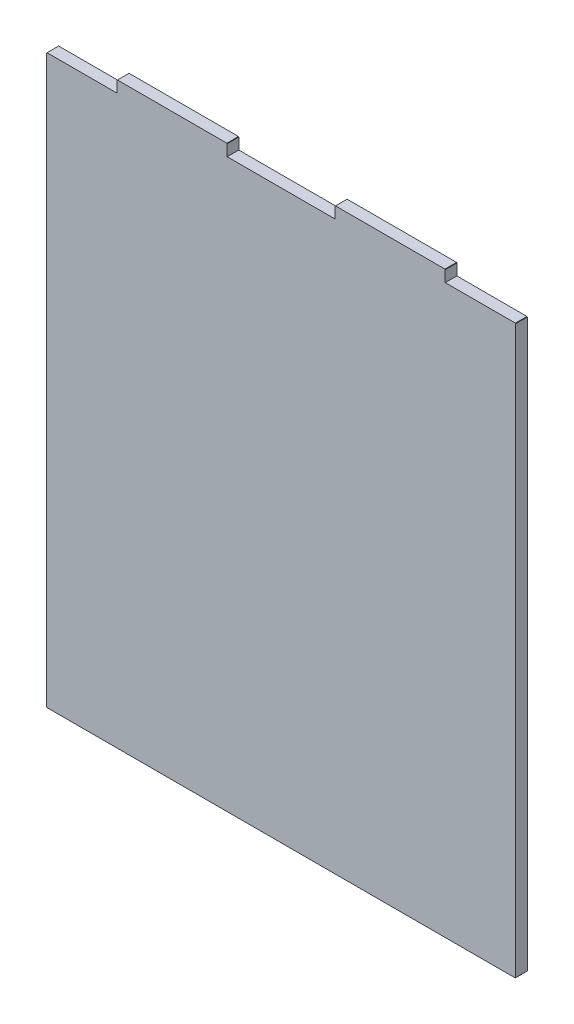
ISO-10303-21;
HEADER;
FILE_DESCRIPTION(('STEP AP214'),'2;1');
FILE_NAME('part.step','',(''),(''),'','','');
FILE_SCHEMA(('AUTOMOTIVE_DESIGN { 1 0 10303 214 1 1 1 1 }'));
ENDSEC;
DATA;
#1=APPLICATION_CONTEXT('core data for automotive mechanical design processes');
#2=APPLICATION_PROTOCOL_DEFINITION('international standard','automotive_design',2000,#1);
#3=PRODUCT_CONTEXT('',#1,'mechanical');
#4=PRODUCT('Part','Part','',(#3));
#5=PRODUCT_RELATED_PRODUCT_CATEGORY('part','',(#4));
#6=PRODUCT_DEFINITION_FORMATION('','',#4);
#7=PRODUCT_DEFINITION_CONTEXT('part definition',#1,'design');
#8=PRODUCT_DEFINITION('design','',#6,#7);
#9=PRODUCT_DEFINITION_SHAPE('','',#8);
#10=(LENGTH_UNIT() NAMED_UNIT(*) SI_UNIT(.MILLI.,.METRE.));
#11=(NAMED_UNIT(*) PLANE_ANGLE_UNIT() SI_UNIT($,.RADIAN.));
#12=(NAMED_UNIT(*) SI_UNIT($,.STERADIAN.) SOLID_ANGLE_UNIT());
#13=UNCERTAINTY_MEASURE_WITH_UNIT(LENGTH_MEASURE(1.E-05),#10,'distance_accuracy_value','');
#14=(GEOMETRIC_REPRESENTATION_CONTEXT(3) GLOBAL_UNCERTAINTY_ASSIGNED_CONTEXT((#13)) GLOBAL_UNIT_ASSIGNED_CONTEXT((#10,
#11,#12)) REPRESENTATION_CONTEXT('',''));
#15=CARTESIAN_POINT('',(0.,0.,0.));
#16=DIRECTION('',(0.,0.,1.));
#17=DIRECTION('',(1.,0.,0.));
#18=AXIS2_PLACEMENT_3D('',#15,#16,#17);
#19=CARTESIAN_POINT('',(260.366151801989,850.122503415874,3.));
#20=DIRECTION('',(-0.707106781178048,0.707106781195047,0.));
#21=DIRECTION('',(-0.707106781195047,-0.707106781178048,0.));
#22=AXIS2_PLACEMENT_3D('',#19,#20,#21);
#23=PLANE('',#22);
#24=DIRECTION('',(0.707106781195047,0.707106781178048,0.));
#25=VECTOR('',#24,1.);
#26=CARTESIAN_POINT('',(260.366151801989,850.122503415874,0.));
#27=LINE('',#26,#25);
#28=CARTESIAN_POINT('',(260.315351801989,850.071703415873,0.));
#29=VERTEX_POINT('',#28);
#30=CARTESIAN_POINT('',(260.391551801989,850.147903415873,0.));
#31=VERTEX_POINT('',#30);
#32=EDGE_CURVE('E158',#29,#31,#27,.T.);
#33=ORIENTED_EDGE('',*,*,#32,.T.);
#34=DIRECTION('',(0.,0.,-1.));
#35=VECTOR('',#34,1.);
#36=CARTESIAN_POINT('',(260.391551801989,850.147903415873,3.));
#37=LINE('',#36,#35);
#38=CARTESIAN_POINT('',(260.391551801989,850.147903415873,3.));
#39=VERTEX_POINT('',#38);
#40=EDGE_CURVE('E11',#39,#31,#37,.T.);
#41=ORIENTED_EDGE('',*,*,#40,.F.);
#42=DIRECTION('',(0.707106781182684,0.707106781190411,0.));
#43=VECTOR('',#42,1.);
#44=CARTESIAN_POINT('',(260.315351801989,850.071703415873,3.));
#45=LINE('',#44,#43);
#46=CARTESIAN_POINT('',(260.315351801989,850.071703415873,3.));
#47=VERTEX_POINT('',#46);
#48=EDGE_CURVE('E164',#47,#39,#45,.T.);
#49=ORIENTED_EDGE('',*,*,#48,.F.);
#50=DIRECTION('',(0.,0.,-1.));
#51=VECTOR('',#50,1.);
#52=CARTESIAN_POINT('',(260.315351801989,850.071703415873,3.));
#53=LINE('',#52,#51);
#54=EDGE_CURVE('E265',#47,#29,#53,.T.);
#55=ORIENTED_EDGE('',*,*,#54,.T.);
#56=EDGE_LOOP('',(#33,#41,#49,#55));
#57=FACE_BOUND('',#56,.T.);
#58=ADVANCED_FACE('F41',(#57),#23,.F.);
#59=CARTESIAN_POINT('',(260.391551801989,850.147903415873,3.));
#60=DIRECTION('',(-0.894427190999525,0.44721359550074,0.));
#61=DIRECTION('',(-0.44721359550074,-0.894427190999525,0.));
#62=AXIS2_PLACEMENT_3D('',#59,#60,#61);
#63=PLANE('',#62);
#64=DIRECTION('',(0.44721359550074,0.894427190999525,0.));
#65=VECTOR('',#64,1.);
#66=CARTESIAN_POINT('',(260.391551801989,850.147903415873,0.));
#67=LINE('',#66,#65);
#68=CARTESIAN_POINT('',(260.416951801989,850.198703415873,0.));
#69=VERTEX_POINT('',#68);
#70=EDGE_CURVE('E270',#31,#69,#67,.T.);
#71=ORIENTED_EDGE('',*,*,#70,.T.);
#72=DIRECTION('',(0.,0.,-1.));
#73=VECTOR('',#72,1.);
#74=CARTESIAN_POINT('',(260.416951801989,850.198703415873,3.));
#75=LINE('',#74,#73);
#76=CARTESIAN_POINT('',(260.416951801989,850.198703415873,3.));
#77=VERTEX_POINT('',#76);
#78=EDGE_CURVE('E49',#77,#69,#75,.T.);
#79=ORIENTED_EDGE('',*,*,#78,.F.);
#80=DIRECTION('',(0.44721359550074,0.894427190999525,0.));
#81=VECTOR('',#80,1.);
#82=CARTESIAN_POINT('',(260.391551801989,850.147903415873,3.));
#83=LINE('',#82,#81);
#84=EDGE_CURVE('E491',#39,#77,#83,.T.);
#85=ORIENTED_EDGE('',*,*,#84,.F.);
#86=ORIENTED_EDGE('',*,*,#40,.T.);
#87=EDGE_LOOP('',(#71,#79,#85,#86));
#88=FACE_BOUND('',#87,.T.);
#89=ADVANCED_FACE('F494',(#88),#63,.F.);
#90=CARTESIAN_POINT('',(260.416951801989,850.198703415873,3.));
#91=DIRECTION('',(-1.,0.,0.));
#92=DIRECTION('',(0.,0.,1.));
#93=AXIS2_PLACEMENT_3D('',#90,#91,#92);
#94=PLANE('',#93);
#95=DIRECTION('',(0.,1.,0.));
#96=VECTOR('',#95,1.);
#97=CARTESIAN_POINT('',(260.416951801989,850.198703415873,0.));
#98=LINE('',#97,#96);
#99=CARTESIAN_POINT('',(260.416951801989,996.629703415873,0.));
#100=VERTEX_POINT('',#99);
#101=EDGE_CURVE('E272',#69,#100,#98,.T.);
#102=ORIENTED_EDGE('',*,*,#101,.T.);
#103=DIRECTION('',(0.,0.,-1.));
#104=VECTOR('',#103,1.);
#105=CARTESIAN_POINT('',(260.416951801989,996.629703415873,3.));
#106=LINE('',#105,#104);
#107=CARTESIAN_POINT('',(260.416951801989,996.629703415873,3.));
#108=VERTEX_POINT('',#107);
#109=EDGE_CURVE('E408',#108,#100,#106,.T.);
#110=ORIENTED_EDGE('',*,*,#109,.F.);
#111=DIRECTION('',(0.,1.,0.));
#112=VECTOR('',#111,1.);
#113=CARTESIAN_POINT('',(260.416951801989,850.198703415873,3.));
#114=LINE('',#113,#112);
#115=EDGE_CURVE('E417',#77,#108,#114,.T.);
#116=ORIENTED_EDGE('',*,*,#115,.F.);
#117=ORIENTED_EDGE('',*,*,#78,.T.);
#118=EDGE_LOOP('',(#102,#110,#116,#117));
#119=FACE_BOUND('',#118,.T.);
#120=ADVANCED_FACE('F415',(#119),#94,.F.);
#121=CARTESIAN_POINT('',(260.416951801989,996.629703415873,3.));
#122=DIRECTION('',(-0.894427190998743,-0.447213595502304,0.));
#123=DIRECTION('',(0.447213595502304,-0.894427190998743,0.));
#124=AXIS2_PLACEMENT_3D('',#121,#122,#123);
#125=PLANE('',#124);
#126=DIRECTION('',(-0.447213595502304,0.894427190998743,0.));
#127=VECTOR('',#126,1.);
#128=CARTESIAN_POINT('',(260.416951801989,996.629703415873,0.));
#129=LINE('',#128,#127);
#130=CARTESIAN_POINT('',(260.391551801989,996.680503415873,0.));
#131=VERTEX_POINT('',#130);
#132=EDGE_CURVE('E274',#100,#131,#129,.T.);
#133=ORIENTED_EDGE('',*,*,#132,.T.);
#134=DIRECTION('',(0.,0.,-1.));
#135=VECTOR('',#134,1.);
#136=CARTESIAN_POINT('',(260.391551801989,996.680503415873,3.));
#137=LINE('',#136,#135);
#138=CARTESIAN_POINT('',(260.391551801989,996.680503415873,3.));
#139=VERTEX_POINT('',#138);
#140=EDGE_CURVE('E405',#139,#131,#137,.T.);
#141=ORIENTED_EDGE('',*,*,#140,.F.);
#142=DIRECTION('',(-0.447213595502304,0.894427190998743,0.));
#143=VECTOR('',#142,1.);
#144=CARTESIAN_POINT('',(260.416951801989,996.629703415873,3.));
#145=LINE('',#144,#143);
#146=EDGE_CURVE('E433',#108,#139,#145,.T.);
#147=ORIENTED_EDGE('',*,*,#146,.F.);
#148=ORIENTED_EDGE('',*,*,#109,.T.);
#149=EDGE_LOOP('',(#133,#141,#147,#148));
#150=FACE_BOUND('',#149,.T.);
#151=ADVANCED_FACE('F424',(#150),#125,.F.);
#152=CARTESIAN_POINT('',(260.366151801989,996.705903415873,3.));
#153=DIRECTION('',(-0.707106781188866,-0.70710678118423,0.));
#154=DIRECTION('',(0.70710678118423,-0.707106781188866,0.));
#155=AXIS2_PLACEMENT_3D('',#152,#153,#154);
#156=PLANE('',#155);
#157=DIRECTION('',(-0.707106781184229,0.707106781188865,0.));
#158=VECTOR('',#157,1.);
#159=CARTESIAN_POINT('',(260.366151801989,996.705903415873,0.));
#160=LINE('',#159,#158);
#161=CARTESIAN_POINT('',(260.340751801989,996.731303415873,0.));
#162=VERTEX_POINT('',#161);
#163=EDGE_CURVE('E277',#131,#162,#160,.T.);
#164=ORIENTED_EDGE('',*,*,#163,.T.);
#165=DIRECTION('',(0.,0.,-1.));
#166=VECTOR('',#165,1.);
#167=CARTESIAN_POINT('',(260.340751801989,996.731303415873,3.));
#168=LINE('',#167,#166);
#169=CARTESIAN_POINT('',(260.340751801989,996.731303415873,3.));
#170=VERTEX_POINT('',#169);
#171=EDGE_CURVE('E402',#170,#162,#168,.T.);
#172=ORIENTED_EDGE('',*,*,#171,.F.);
#173=DIRECTION('',(-0.707106781188865,0.707106781184229,0.));
#174=VECTOR('',#173,1.);
#175=CARTESIAN_POINT('',(260.391551801989,996.680503415873,3.));
#176=LINE('',#175,#174);
#177=EDGE_CURVE('E430',#139,#170,#176,.T.);
#178=ORIENTED_EDGE('',*,*,#177,.F.);
#179=ORIENTED_EDGE('',*,*,#140,.T.);
#180=EDGE_LOOP('',(#164,#172,#178,#179));
#181=FACE_BOUND('',#180,.T.);
#182=ADVANCED_FACE('F428',(#181),#156,.F.);
#183=CARTESIAN_POINT('',(260.315351801989,996.731303415873,3.));
#184=DIRECTION('',(0.,-1.,0.));
#185=DIRECTION('',(0.,0.,-1.));
#186=AXIS2_PLACEMENT_3D('',#183,#184,#185);
#187=PLANE('',#186);
#188=DIRECTION('',(-1.,0.,0.));
#189=VECTOR('',#188,1.);
#190=CARTESIAN_POINT('',(260.315351801989,996.731303415873,0.));
#191=LINE('',#190,#189);
#192=CARTESIAN_POINT('',(242.205151801989,996.731303415873,0.));
#193=VERTEX_POINT('',#192);
#194=EDGE_CURVE('E280',#162,#193,#191,.T.);
#195=ORIENTED_EDGE('',*,*,#194,.T.);
#196=DIRECTION('',(0.,0.,-1.));
#197=VECTOR('',#196,1.);
#198=CARTESIAN_POINT('',(242.205151801989,996.731303415873,3.));
#199=LINE('',#198,#197);
#200=CARTESIAN_POINT('',(242.205151801989,996.731303415873,3.));
#201=VERTEX_POINT('',#200);
#202=EDGE_CURVE('E399',#201,#193,#199,.T.);
#203=ORIENTED_EDGE('',*,*,#202,.F.);
#204=DIRECTION('',(-1.,0.,0.));
#205=VECTOR('',#204,1.);
#206=CARTESIAN_POINT('',(260.340751801989,996.731303415873,3.));
#207=LINE('',#206,#205);
#208=EDGE_CURVE('E432',#170,#201,#207,.T.);
#209=ORIENTED_EDGE('',*,*,#208,.F.);
#210=ORIENTED_EDGE('',*,*,#171,.T.);
#211=EDGE_LOOP('',(#195,#203,#209,#210));
#212=FACE_BOUND('',#211,.T.);
#213=ADVANCED_FACE('F507',(#212),#187,.F.);
#214=CARTESIAN_POINT('',(242.205151801989,996.731303415873,3.));
#215=DIRECTION('',(-1.,0.,0.));
#216=DIRECTION('',(0.,0.,1.));
#217=AXIS2_PLACEMENT_3D('',#214,#215,#216);
#218=PLANE('',#217);
#219=DIRECTION('',(0.,1.,0.));
#220=VECTOR('',#219,1.);
#221=CARTESIAN_POINT('',(242.205151801989,996.731303415873,0.));
#222=LINE('',#221,#220);
#223=CARTESIAN_POINT('',(242.205151801989,999.626903415873,0.));
#224=VERTEX_POINT('',#223);
#225=EDGE_CURVE('E282',#193,#224,#222,.T.);
#226=ORIENTED_EDGE('',*,*,#225,.T.);
#227=DIRECTION('',(0.,0.,-1.));
#228=VECTOR('',#227,1.);
#229=CARTESIAN_POINT('',(242.205151801989,999.626903415873,3.));
#230=LINE('',#229,#228);
#231=CARTESIAN_POINT('',(242.205151801989,999.626903415873,3.));
#232=VERTEX_POINT('',#231);
#233=EDGE_CURVE('E396',#232,#224,#230,.T.);
#234=ORIENTED_EDGE('',*,*,#233,.F.);
#235=DIRECTION('',(0.,1.,0.));
#236=VECTOR('',#235,1.);
#237=CARTESIAN_POINT('',(242.205151801989,996.731303415873,3.));
#238=LINE('',#237,#236);
#239=EDGE_CURVE('E435',#201,#232,#238,.T.);
#240=ORIENTED_EDGE('',*,*,#239,.F.);
#241=ORIENTED_EDGE('',*,*,#202,.T.);
#242=EDGE_LOOP('',(#226,#234,#240,#241));
#243=FACE_BOUND('',#242,.T.);
#244=ADVANCED_FACE('F510',(#243),#218,.F.);
#245=CARTESIAN_POINT('',(242.205151801989,999.626903415873,3.));
#246=DIRECTION('',(-0.894427190999916,-0.447213595499958,0.));
#247=DIRECTION('',(0.447213595499958,-0.894427190999916,0.));
#248=AXIS2_PLACEMENT_3D('',#245,#246,#247);
#249=PLANE('',#248);
#250=DIRECTION('',(-0.447213595499958,0.894427190999916,0.));
#251=VECTOR('',#250,1.);
#252=CARTESIAN_POINT('',(242.205151801989,999.626903415873,0.));
#253=LINE('',#252,#251);
#254=CARTESIAN_POINT('',(242.179751801989,999.677703415873,0.));
#255=VERTEX_POINT('',#254);
#256=EDGE_CURVE('E284',#224,#255,#253,.T.);
#257=ORIENTED_EDGE('',*,*,#256,.T.);
#258=DIRECTION('',(0.,0.,-1.));
#259=VECTOR('',#258,1.);
#260=CARTESIAN_POINT('',(242.179751801989,999.677703415873,3.));
#261=LINE('',#260,#259);
#262=CARTESIAN_POINT('',(242.179751801989,999.677703415873,3.));
#263=VERTEX_POINT('',#262);
#264=EDGE_CURVE('E393',#263,#255,#261,.T.);
#265=ORIENTED_EDGE('',*,*,#264,.F.);
#266=DIRECTION('',(-0.447213595499958,0.894427190999916,0.));
#267=VECTOR('',#266,1.);
#268=CARTESIAN_POINT('',(242.205151801989,999.626903415873,3.));
#269=LINE('',#268,#267);
#270=EDGE_CURVE('E441',#232,#263,#269,.T.);
#271=ORIENTED_EDGE('',*,*,#270,.F.);
#272=ORIENTED_EDGE('',*,*,#233,.T.);
#273=EDGE_LOOP('',(#257,#265,#271,#272));
#274=FACE_BOUND('',#273,.T.);
#275=ADVANCED_FACE('F514',(#274),#249,.F.);
#276=CARTESIAN_POINT('',(242.179751801989,999.677703415873,3.));
#277=DIRECTION('',(-1.,0.,0.));
#278=DIRECTION('',(0.,0.,1.));
#279=AXIS2_PLACEMENT_3D('',#276,#277,#278);
#280=PLANE('',#279);
#281=DIRECTION('',(0.,1.,0.));
#282=VECTOR('',#281,1.);
#283=CARTESIAN_POINT('',(242.179751801989,999.677703415873,0.));
#284=LINE('',#283,#282);
#285=CARTESIAN_POINT('',(242.179751801989,999.703103415873,0.));
#286=VERTEX_POINT('',#285);
#287=EDGE_CURVE('E286',#255,#286,#284,.T.);
#288=ORIENTED_EDGE('',*,*,#287,.T.);
#289=DIRECTION('',(0.,0.,-1.));
#290=VECTOR('',#289,1.);
#291=CARTESIAN_POINT('',(242.179751801989,999.703103415873,3.));
#292=LINE('',#291,#290);
#293=CARTESIAN_POINT('',(242.179751801989,999.703103415873,3.));
#294=VERTEX_POINT('',#293);
#295=EDGE_CURVE('E390',#294,#286,#292,.T.);
#296=ORIENTED_EDGE('',*,*,#295,.F.);
#297=DIRECTION('',(0.,1.,0.));
#298=VECTOR('',#297,1.);
#299=CARTESIAN_POINT('',(242.179751801989,999.677703415873,3.));
#300=LINE('',#299,#298);
#301=EDGE_CURVE('E443',#263,#294,#300,.T.);
#302=ORIENTED_EDGE('',*,*,#301,.F.);
#303=ORIENTED_EDGE('',*,*,#264,.T.);
#304=EDGE_LOOP('',(#288,#296,#302,#303));
#305=FACE_BOUND('',#304,.T.);
#306=ADVANCED_FACE('F518',(#305),#280,.F.);
#307=CARTESIAN_POINT('',(242.179751801989,999.703103415873,3.));
#308=DIRECTION('',(0.,-1.,0.));
#309=DIRECTION('',(0.,0.,-1.));
#310=AXIS2_PLACEMENT_3D('',#307,#308,#309);
#311=PLANE('',#310);
#312=DIRECTION('',(-1.,0.,0.));
#313=VECTOR('',#312,1.);
#314=CARTESIAN_POINT('',(242.179751801989,999.703103415873,0.));
#315=LINE('',#314,#313);
#316=CARTESIAN_POINT('',(242.154351801989,999.703103415873,0.));
#317=VERTEX_POINT('',#316);
#318=EDGE_CURVE('E288',#286,#317,#315,.T.);
#319=ORIENTED_EDGE('',*,*,#318,.T.);
#320=DIRECTION('',(0.,0.,-1.));
#321=VECTOR('',#320,1.);
#322=CARTESIAN_POINT('',(242.154351801989,999.703103415873,3.));
#323=LINE('',#322,#321);
#324=CARTESIAN_POINT('',(242.154351801989,999.703103415873,3.));
#325=VERTEX_POINT('',#324);
#326=EDGE_CURVE('E387',#325,#317,#323,.T.);
#327=ORIENTED_EDGE('',*,*,#326,.F.);
#328=DIRECTION('',(-1.,0.,0.));
#329=VECTOR('',#328,1.);
#330=CARTESIAN_POINT('',(242.179751801989,999.703103415873,3.));
#331=LINE('',#330,#329);
#332=EDGE_CURVE('E445',#294,#325,#331,.T.);
#333=ORIENTED_EDGE('',*,*,#332,.F.);
#334=ORIENTED_EDGE('',*,*,#295,.T.);
#335=EDGE_LOOP('',(#319,#327,#333,#334));
#336=FACE_BOUND('',#335,.T.);
#337=ADVANCED_FACE('F522',(#336),#311,.F.);
#338=CARTESIAN_POINT('',(242.154351801989,999.703103415873,3.));
#339=DIRECTION('',(-0.707106781190024,-0.70710678118307,0.));
#340=DIRECTION('',(0.70710678118307,-0.707106781190025,0.));
#341=AXIS2_PLACEMENT_3D('',#338,#339,#340);
#342=PLANE('',#341);
#343=DIRECTION('',(-0.70710678118307,0.707106781190025,0.));
#344=VECTOR('',#343,1.);
#345=CARTESIAN_POINT('',(242.154351801989,999.703103415873,0.));
#346=LINE('',#345,#344);
#347=CARTESIAN_POINT('',(242.128951801989,999.728503415874,0.));
#348=VERTEX_POINT('',#347);
#349=EDGE_CURVE('E290',#317,#348,#346,.T.);
#350=ORIENTED_EDGE('',*,*,#349,.T.);
#351=DIRECTION('',(0.,0.,-1.));
#352=VECTOR('',#351,1.);
#353=CARTESIAN_POINT('',(242.128951801989,999.728503415874,3.));
#354=LINE('',#353,#352);
#355=CARTESIAN_POINT('',(242.128951801989,999.728503415874,3.));
#356=VERTEX_POINT('',#355);
#357=EDGE_CURVE('E384',#356,#348,#354,.T.);
#358=ORIENTED_EDGE('',*,*,#357,.F.);
#359=DIRECTION('',(-0.70710678118307,0.707106781190025,0.));
#360=VECTOR('',#359,1.);
#361=CARTESIAN_POINT('',(242.154351801989,999.703103415873,3.));
#362=LINE('',#361,#360);
#363=EDGE_CURVE('E447',#325,#356,#362,.T.);
#364=ORIENTED_EDGE('',*,*,#363,.F.);
#365=ORIENTED_EDGE('',*,*,#326,.T.);
#366=EDGE_LOOP('',(#350,#358,#364,#365));
#367=FACE_BOUND('',#366,.T.);
#368=ADVANCED_FACE('F526',(#367),#342,.F.);
#369=CARTESIAN_POINT('',(213.85875180199,999.728503415874,3.));
#370=DIRECTION('',(0.,-1.,0.));
#371=DIRECTION('',(0.,0.,-1.));
#372=AXIS2_PLACEMENT_3D('',#369,#370,#371);
#373=PLANE('',#372);
#374=DIRECTION('',(-1.,0.,0.));
#375=VECTOR('',#374,1.);
#376=CARTESIAN_POINT('',(213.85875180199,999.728503415874,0.));
#377=LINE('',#376,#375);
#378=CARTESIAN_POINT('',(213.833351801989,999.728503415874,0.));
#379=VERTEX_POINT('',#378);
#380=EDGE_CURVE('E293',#348,#379,#377,.T.);
#381=ORIENTED_EDGE('',*,*,#380,.T.);
#382=DIRECTION('',(0.,0.,-1.));
#383=VECTOR('',#382,1.);
#384=CARTESIAN_POINT('',(213.833351801989,999.728503415874,3.));
#385=LINE('',#384,#383);
#386=CARTESIAN_POINT('',(213.833351801989,999.728503415874,3.));
#387=VERTEX_POINT('',#386);
#388=EDGE_CURVE('E381',#387,#379,#385,.T.);
#389=ORIENTED_EDGE('',*,*,#388,.F.);
#390=DIRECTION('',(-1.,0.,0.));
#391=VECTOR('',#390,1.);
#392=CARTESIAN_POINT('',(242.128951801989,999.728503415874,3.));
#393=LINE('',#392,#391);
#394=EDGE_CURVE('E449',#356,#387,#393,.T.);
#395=ORIENTED_EDGE('',*,*,#394,.F.);
#396=ORIENTED_EDGE('',*,*,#357,.T.);
#397=EDGE_LOOP('',(#381,#389,#395,#396));
#398=FACE_BOUND('',#397,.T.);
#399=ADVANCED_FACE('F530',(#398),#373,.F.);
#400=CARTESIAN_POINT('',(213.807951801989,999.703103415873,3.));
#401=DIRECTION('',(0.707106781186161,-0.707106781186934,0.));
#402=DIRECTION('',(0.707106781186934,0.707106781186161,0.));
#403=AXIS2_PLACEMENT_3D('',#400,#401,#402);
#404=PLANE('',#403);
#405=DIRECTION('',(-0.707106781186934,-0.707106781186161,0.));
#406=VECTOR('',#405,1.);
#407=CARTESIAN_POINT('',(213.807951801989,999.703103415873,0.));
#408=LINE('',#407,#406);
#409=CARTESIAN_POINT('',(213.782551801989,999.677703415873,0.));
#410=VERTEX_POINT('',#409);
#411=EDGE_CURVE('E296',#379,#410,#408,.T.);
#412=ORIENTED_EDGE('',*,*,#411,.T.);
#413=DIRECTION('',(0.,0.,-1.));
#414=VECTOR('',#413,1.);
#415=CARTESIAN_POINT('',(213.782551801989,999.677703415873,3.));
#416=LINE('',#415,#414);
#417=CARTESIAN_POINT('',(213.782551801989,999.677703415873,3.));
#418=VERTEX_POINT('',#417);
#419=EDGE_CURVE('E378',#418,#410,#416,.T.);
#420=ORIENTED_EDGE('',*,*,#419,.F.);
#421=DIRECTION('',(-0.707106781183843,-0.707106781189252,0.));
#422=VECTOR('',#421,1.);
#423=CARTESIAN_POINT('',(213.833351801989,999.728503415874,3.));
#424=LINE('',#423,#422);
#425=EDGE_CURVE('E451',#387,#418,#424,.T.);
#426=ORIENTED_EDGE('',*,*,#425,.F.);
#427=ORIENTED_EDGE('',*,*,#388,.T.);
#428=EDGE_LOOP('',(#412,#420,#426,#427));
#429=FACE_BOUND('',#428,.T.);
#430=ADVANCED_FACE('F534',(#429),#404,.F.);
#431=CARTESIAN_POINT('',(213.782551801989,999.677703415873,3.));
#432=DIRECTION('',(0.894427191000111,-0.447213595499567,0.));
#433=DIRECTION('',(0.447213595499567,0.894427191000111,0.));
#434=AXIS2_PLACEMENT_3D('',#431,#432,#433);
#435=PLANE('',#434);
#436=DIRECTION('',(-0.447213595499567,-0.894427191000111,0.));
#437=VECTOR('',#436,1.);
#438=CARTESIAN_POINT('',(213.782551801989,999.677703415873,0.));
#439=LINE('',#438,#437);
#440=CARTESIAN_POINT('',(213.757151801989,999.626903415873,0.));
#441=VERTEX_POINT('',#440);
#442=EDGE_CURVE('E298',#410,#441,#439,.T.);
#443=ORIENTED_EDGE('',*,*,#442,.T.);
#444=DIRECTION('',(0.,0.,-1.));
#445=VECTOR('',#444,1.);
#446=CARTESIAN_POINT('',(213.757151801989,999.626903415873,3.));
#447=LINE('',#446,#445);
#448=CARTESIAN_POINT('',(213.757151801989,999.626903415873,3.));
#449=VERTEX_POINT('',#448);
#450=EDGE_CURVE('E375',#449,#441,#447,.T.);
#451=ORIENTED_EDGE('',*,*,#450,.F.);
#452=DIRECTION('',(-0.447213595499567,-0.894427191000111,0.));
#453=VECTOR('',#452,1.);
#454=CARTESIAN_POINT('',(213.782551801989,999.677703415873,3.));
#455=LINE('',#454,#453);
#456=EDGE_CURVE('E453',#418,#449,#455,.T.);
#457=ORIENTED_EDGE('',*,*,#456,.F.);
#458=ORIENTED_EDGE('',*,*,#419,.T.);
#459=EDGE_LOOP('',(#443,#451,#457,#458));
#460=FACE_BOUND('',#459,.T.);
#461=ADVANCED_FACE('F538',(#460),#435,.F.);
#462=CARTESIAN_POINT('',(213.757151801989,999.626903415873,3.));
#463=DIRECTION('',(1.,0.,0.));
#464=DIRECTION('',(0.,0.,-1.));
#465=AXIS2_PLACEMENT_3D('',#462,#463,#464);
#466=PLANE('',#465);
#467=DIRECTION('',(0.,-1.,0.));
#468=VECTOR('',#467,1.);
#469=CARTESIAN_POINT('',(213.757151801989,999.626903415873,0.));
#470=LINE('',#469,#468);
#471=CARTESIAN_POINT('',(213.757151801989,996.731303415873,0.));
#472=VERTEX_POINT('',#471);
#473=EDGE_CURVE('E300',#441,#472,#470,.T.);
#474=ORIENTED_EDGE('',*,*,#473,.T.);
#475=DIRECTION('',(0.,0.,-1.));
#476=VECTOR('',#475,1.);
#477=CARTESIAN_POINT('',(213.757151801989,996.731303415873,3.));
#478=LINE('',#477,#476);
#479=CARTESIAN_POINT('',(213.757151801989,996.731303415873,3.));
#480=VERTEX_POINT('',#479);
#481=EDGE_CURVE('E372',#480,#472,#478,.T.);
#482=ORIENTED_EDGE('',*,*,#481,.F.);
#483=DIRECTION('',(0.,-1.,0.));
#484=VECTOR('',#483,1.);
#485=CARTESIAN_POINT('',(213.757151801989,999.626903415873,3.));
#486=LINE('',#485,#484);
#487=EDGE_CURVE('E455',#449,#480,#486,.T.);
#488=ORIENTED_EDGE('',*,*,#487,.F.);
#489=ORIENTED_EDGE('',*,*,#450,.T.);
#490=EDGE_LOOP('',(#474,#482,#488,#489));
#491=FACE_BOUND('',#490,.T.);
#492=ADVANCED_FACE('F542',(#491),#466,.F.);
#493=CARTESIAN_POINT('',(213.757151801989,996.731303415873,3.));
#494=DIRECTION('',(0.,-1.,0.));
#495=DIRECTION('',(0.,0.,-1.));
#496=AXIS2_PLACEMENT_3D('',#493,#494,#495);
#497=PLANE('',#496);
#498=DIRECTION('',(-1.,0.,0.));
#499=VECTOR('',#498,1.);
#500=CARTESIAN_POINT('',(213.757151801989,996.731303415873,0.));
#501=LINE('',#500,#499);
#502=CARTESIAN_POINT('',(185.817151801989,996.731303415873,0.));
#503=VERTEX_POINT('',#502);
#504=EDGE_CURVE('E302',#472,#503,#501,.T.);
#505=ORIENTED_EDGE('',*,*,#504,.T.);
#506=DIRECTION('',(0.,0.,-1.));
#507=VECTOR('',#506,1.);
#508=CARTESIAN_POINT('',(185.817151801989,996.731303415873,3.));
#509=LINE('',#508,#507);
#510=CARTESIAN_POINT('',(185.817151801989,996.731303415873,3.));
#511=VERTEX_POINT('',#510);
#512=EDGE_CURVE('E369',#511,#503,#509,.T.);
#513=ORIENTED_EDGE('',*,*,#512,.F.);
#514=DIRECTION('',(-1.,0.,0.));
#515=VECTOR('',#514,1.);
#516=CARTESIAN_POINT('',(213.757151801989,996.731303415873,3.));
#517=LINE('',#516,#515);
#518=EDGE_CURVE('E457',#480,#511,#517,.T.);
#519=ORIENTED_EDGE('',*,*,#518,.F.);
#520=ORIENTED_EDGE('',*,*,#481,.T.);
#521=EDGE_LOOP('',(#505,#513,#519,#520));
#522=FACE_BOUND('',#521,.T.);
#523=ADVANCED_FACE('F546',(#522),#497,.F.);
#524=CARTESIAN_POINT('',(185.817151801989,996.731303415873,3.));
#525=DIRECTION('',(-1.,0.,0.));
#526=DIRECTION('',(0.,0.,1.));
#527=AXIS2_PLACEMENT_3D('',#524,#525,#526);
#528=PLANE('',#527);
#529=DIRECTION('',(0.,1.,0.));
#530=VECTOR('',#529,1.);
#531=CARTESIAN_POINT('',(185.817151801989,996.731303415873,0.));
#532=LINE('',#531,#530);
#533=CARTESIAN_POINT('',(185.817151801989,999.626903415873,0.));
#534=VERTEX_POINT('',#533);
#535=EDGE_CURVE('E304',#503,#534,#532,.T.);
#536=ORIENTED_EDGE('',*,*,#535,.T.);
#537=DIRECTION('',(0.,0.,-1.));
#538=VECTOR('',#537,1.);
#539=CARTESIAN_POINT('',(185.817151801989,999.626903415873,3.));
#540=LINE('',#539,#538);
#541=CARTESIAN_POINT('',(185.817151801989,999.626903415873,3.));
#542=VERTEX_POINT('',#541);
#543=EDGE_CURVE('E366',#542,#534,#540,.T.);
#544=ORIENTED_EDGE('',*,*,#543,.F.);
#545=DIRECTION('',(0.,1.,0.));
#546=VECTOR('',#545,1.);
#547=CARTESIAN_POINT('',(185.817151801989,996.731303415873,3.));
#548=LINE('',#547,#546);
#549=EDGE_CURVE('E459',#511,#542,#548,.T.);
#550=ORIENTED_EDGE('',*,*,#549,.F.);
#551=ORIENTED_EDGE('',*,*,#512,.T.);
#552=EDGE_LOOP('',(#536,#544,#550,#551));
#553=FACE_BOUND('',#552,.T.);
#554=ADVANCED_FACE('F550',(#553),#528,.F.);
#555=CARTESIAN_POINT('',(185.817151801989,999.626903415873,3.));
#556=DIRECTION('',(-0.894427191000111,-0.447213595499567,0.));
#557=DIRECTION('',(0.447213595499567,-0.894427191000111,0.));
#558=AXIS2_PLACEMENT_3D('',#555,#556,#557);
#559=PLANE('',#558);
#560=DIRECTION('',(-0.447213595499567,0.894427191000111,0.));
#561=VECTOR('',#560,1.);
#562=CARTESIAN_POINT('',(185.817151801989,999.626903415873,0.));
#563=LINE('',#562,#561);
#564=CARTESIAN_POINT('',(185.791751801989,999.677703415873,0.));
#565=VERTEX_POINT('',#564);
#566=EDGE_CURVE('E306',#534,#565,#563,.T.);
#567=ORIENTED_EDGE('',*,*,#566,.T.);
#568=DIRECTION('',(0.,0.,-1.));
#569=VECTOR('',#568,1.);
#570=CARTESIAN_POINT('',(185.791751801989,999.677703415873,3.));
#571=LINE('',#570,#569);
#572=CARTESIAN_POINT('',(185.791751801989,999.677703415873,3.));
#573=VERTEX_POINT('',#572);
#574=EDGE_CURVE('E363',#573,#565,#571,.T.);
#575=ORIENTED_EDGE('',*,*,#574,.F.);
#576=DIRECTION('',(-0.447213595499567,0.894427191000111,0.));
#577=VECTOR('',#576,1.);
#578=CARTESIAN_POINT('',(185.817151801989,999.626903415873,3.));
#579=LINE('',#578,#577);
#580=EDGE_CURVE('E461',#542,#573,#579,.T.);
#581=ORIENTED_EDGE('',*,*,#580,.F.);
#582=ORIENTED_EDGE('',*,*,#543,.T.);
#583=EDGE_LOOP('',(#567,#575,#581,#582));
#584=FACE_BOUND('',#583,.T.);
#585=ADVANCED_FACE('F554',(#584),#559,.F.);
#586=CARTESIAN_POINT('',(185.766351801989,999.703103415873,3.));
#587=DIRECTION('',(-0.707106781189638,-0.707106781183457,0.));
#588=DIRECTION('',(0.707106781183457,-0.707106781189638,0.));
#589=AXIS2_PLACEMENT_3D('',#586,#587,#588);
#590=PLANE('',#589);
#591=DIRECTION('',(-0.707106781183457,0.707106781189638,0.));
#592=VECTOR('',#591,1.);
#593=CARTESIAN_POINT('',(185.766351801989,999.703103415873,0.));
#594=LINE('',#593,#592);
#595=CARTESIAN_POINT('',(185.740951801989,999.728503415874,0.));
#596=VERTEX_POINT('',#595);
#597=EDGE_CURVE('E309',#565,#596,#594,.T.);
#598=ORIENTED_EDGE('',*,*,#597,.T.);
#599=DIRECTION('',(0.,0.,-1.));
#600=VECTOR('',#599,1.);
#601=CARTESIAN_POINT('',(185.740951801989,999.728503415874,3.));
#602=LINE('',#601,#600);
#603=CARTESIAN_POINT('',(185.740951801989,999.728503415874,3.));
#604=VERTEX_POINT('',#603);
#605=EDGE_CURVE('E360',#604,#596,#602,.T.);
#606=ORIENTED_EDGE('',*,*,#605,.F.);
#607=DIRECTION('',(-0.70710678118732,0.707106781185775,0.));
#608=VECTOR('',#607,1.);
#609=CARTESIAN_POINT('',(185.791751801989,999.677703415873,3.));
#610=LINE('',#609,#608);
#611=EDGE_CURVE('E463',#573,#604,#610,.T.);
#612=ORIENTED_EDGE('',*,*,#611,.F.);
#613=ORIENTED_EDGE('',*,*,#574,.T.);
#614=EDGE_LOOP('',(#598,#606,#612,#613));
#615=FACE_BOUND('',#614,.T.);
#616=ADVANCED_FACE('F558',(#615),#590,.F.);
#617=CARTESIAN_POINT('',(157.470751801989,999.728503415874,3.));
#618=DIRECTION('',(0.,-1.,0.));
#619=DIRECTION('',(0.,0.,-1.));
#620=AXIS2_PLACEMENT_3D('',#617,#618,#619);
#621=PLANE('',#620);
#622=DIRECTION('',(-1.,0.,0.));
#623=VECTOR('',#622,1.);
#624=CARTESIAN_POINT('',(157.470751801989,999.728503415874,0.));
#625=LINE('',#624,#623);
#626=CARTESIAN_POINT('',(157.445351801989,999.728503415874,0.));
#627=VERTEX_POINT('',#626);
#628=EDGE_CURVE('E312',#596,#627,#625,.T.);
#629=ORIENTED_EDGE('',*,*,#628,.T.);
#630=DIRECTION('',(0.,0.,-1.));
#631=VECTOR('',#630,1.);
#632=CARTESIAN_POINT('',(157.445351801989,999.728503415874,3.));
#633=LINE('',#632,#631);
#634=CARTESIAN_POINT('',(157.445351801989,999.728503415874,3.));
#635=VERTEX_POINT('',#634);
#636=EDGE_CURVE('E357',#635,#627,#633,.T.);
#637=ORIENTED_EDGE('',*,*,#636,.F.);
#638=DIRECTION('',(-1.,0.,0.));
#639=VECTOR('',#638,1.);
#640=CARTESIAN_POINT('',(185.740951801989,999.728503415874,3.));
#641=LINE('',#640,#639);
#642=EDGE_CURVE('E465',#604,#635,#641,.T.);
#643=ORIENTED_EDGE('',*,*,#642,.F.);
#644=ORIENTED_EDGE('',*,*,#605,.T.);
#645=EDGE_LOOP('',(#629,#637,#643,#644));
#646=FACE_BOUND('',#645,.T.);
#647=ADVANCED_FACE('F562',(#646),#621,.F.);
#648=CARTESIAN_POINT('',(157.419951801989,999.703103415873,3.));
#649=DIRECTION('',(0.707106781185388,-0.707106781187707,0.));
#650=DIRECTION('',(0.707106781187707,0.707106781185388,0.));
#651=AXIS2_PLACEMENT_3D('',#648,#649,#650);
#652=PLANE('',#651);
#653=DIRECTION('',(-0.707106781187706,-0.707106781185388,0.));
#654=VECTOR('',#653,1.);
#655=CARTESIAN_POINT('',(157.419951801989,999.703103415873,0.));
#656=LINE('',#655,#654);
#657=CARTESIAN_POINT('',(157.394551801989,999.677703415873,0.));
#658=VERTEX_POINT('',#657);
#659=EDGE_CURVE('E315',#627,#658,#656,.T.);
#660=ORIENTED_EDGE('',*,*,#659,.T.);
#661=DIRECTION('',(0.,0.,-1.));
#662=VECTOR('',#661,1.);
#663=CARTESIAN_POINT('',(157.394551801989,999.677703415873,3.));
#664=LINE('',#663,#662);
#665=CARTESIAN_POINT('',(157.394551801989,999.677703415873,3.));
#666=VERTEX_POINT('',#665);
#667=EDGE_CURVE('E354',#666,#658,#664,.T.);
#668=ORIENTED_EDGE('',*,*,#667,.F.);
#669=DIRECTION('',(-0.707106781182684,-0.707106781190411,0.));
#670=VECTOR('',#669,1.);
#671=CARTESIAN_POINT('',(157.445351801989,999.728503415874,3.));
#672=LINE('',#671,#670);
#673=EDGE_CURVE('E467',#635,#666,#672,.T.);
#674=ORIENTED_EDGE('',*,*,#673,.F.);
#675=ORIENTED_EDGE('',*,*,#636,.T.);
#676=EDGE_LOOP('',(#660,#668,#674,#675));
#677=FACE_BOUND('',#676,.T.);
#678=ADVANCED_FACE('F566',(#677),#652,.F.);
#679=CARTESIAN_POINT('',(157.394551801989,999.677703415873,3.));
#680=DIRECTION('',(0.894427191000111,-0.447213595499567,0.));
#681=DIRECTION('',(0.447213595499567,0.894427191000111,0.));
#682=AXIS2_PLACEMENT_3D('',#679,#680,#681);
#683=PLANE('',#682);
#684=DIRECTION('',(-0.447213595499567,-0.894427191000111,0.));
#685=VECTOR('',#684,1.);
#686=CARTESIAN_POINT('',(157.394551801989,999.677703415873,0.));
#687=LINE('',#686,#685);
#688=CARTESIAN_POINT('',(157.369151801989,999.626903415873,0.));
#689=VERTEX_POINT('',#688);
#690=EDGE_CURVE('E317',#658,#689,#687,.T.);
#691=ORIENTED_EDGE('',*,*,#690,.T.);
#692=DIRECTION('',(0.,0.,-1.));
#693=VECTOR('',#692,1.);
#694=CARTESIAN_POINT('',(157.369151801989,999.626903415873,3.));
#695=LINE('',#694,#693);
#696=CARTESIAN_POINT('',(157.369151801989,999.626903415873,3.));
#697=VERTEX_POINT('',#696);
#698=EDGE_CURVE('E351',#697,#689,#695,.T.);
#699=ORIENTED_EDGE('',*,*,#698,.F.);
#700=DIRECTION('',(-0.447213595499567,-0.894427191000111,0.));
#701=VECTOR('',#700,1.);
#702=CARTESIAN_POINT('',(157.394551801989,999.677703415873,3.));
#703=LINE('',#702,#701);
#704=EDGE_CURVE('E469',#666,#697,#703,.T.);
#705=ORIENTED_EDGE('',*,*,#704,.F.);
#706=ORIENTED_EDGE('',*,*,#667,.T.);
#707=EDGE_LOOP('',(#691,#699,#705,#706));
#708=FACE_BOUND('',#707,.T.);
#709=ADVANCED_FACE('F570',(#708),#683,.F.);
#710=CARTESIAN_POINT('',(157.369151801989,999.626903415873,3.));
#711=DIRECTION('',(1.,0.,0.));
#712=DIRECTION('',(0.,0.,-1.));
#713=AXIS2_PLACEMENT_3D('',#710,#711,#712);
#714=PLANE('',#713);
#715=DIRECTION('',(0.,-1.,0.));
#716=VECTOR('',#715,1.);
#717=CARTESIAN_POINT('',(157.369151801989,999.626903415873,0.));
#718=LINE('',#717,#716);
#719=CARTESIAN_POINT('',(157.369151801989,996.731303415873,0.));
#720=VERTEX_POINT('',#719);
#721=EDGE_CURVE('E319',#689,#720,#718,.T.);
#722=ORIENTED_EDGE('',*,*,#721,.T.);
#723=DIRECTION('',(0.,0.,-1.));
#724=VECTOR('',#723,1.);
#725=CARTESIAN_POINT('',(157.369151801989,996.731303415873,3.));
#726=LINE('',#725,#724);
#727=CARTESIAN_POINT('',(157.369151801989,996.731303415873,3.));
#728=VERTEX_POINT('',#727);
#729=EDGE_CURVE('E348',#728,#720,#726,.T.);
#730=ORIENTED_EDGE('',*,*,#729,.F.);
#731=DIRECTION('',(0.,-1.,0.));
#732=VECTOR('',#731,1.);
#733=CARTESIAN_POINT('',(157.369151801989,999.626903415873,3.));
#734=LINE('',#733,#732);
#735=EDGE_CURVE('E471',#697,#728,#734,.T.);
#736=ORIENTED_EDGE('',*,*,#735,.F.);
#737=ORIENTED_EDGE('',*,*,#698,.T.);
#738=EDGE_LOOP('',(#722,#730,#736,#737));
#739=FACE_BOUND('',#738,.T.);
#740=ADVANCED_FACE('F574',(#739),#714,.F.);
#741=CARTESIAN_POINT('',(139.258951801989,996.731303415873,3.));
#742=DIRECTION('',(0.,-1.,0.));
#743=DIRECTION('',(0.,0.,-1.));
#744=AXIS2_PLACEMENT_3D('',#741,#742,#743);
#745=PLANE('',#744);
#746=DIRECTION('',(-1.,0.,0.));
#747=VECTOR('',#746,1.);
#748=CARTESIAN_POINT('',(139.258951801989,996.731303415873,0.));
#749=LINE('',#748,#747);
#750=CARTESIAN_POINT('',(139.233551801989,996.731303415873,0.));
#751=VERTEX_POINT('',#750);
#752=EDGE_CURVE('E322',#720,#751,#749,.T.);
#753=ORIENTED_EDGE('',*,*,#752,.T.);
#754=DIRECTION('',(0.,0.,-1.));
#755=VECTOR('',#754,1.);
#756=CARTESIAN_POINT('',(139.233551801989,996.731303415873,3.));
#757=LINE('',#756,#755);
#758=CARTESIAN_POINT('',(139.233551801989,996.731303415873,3.));
#759=VERTEX_POINT('',#758);
#760=EDGE_CURVE('E345',#759,#751,#757,.T.);
#761=ORIENTED_EDGE('',*,*,#760,.F.);
#762=DIRECTION('',(-1.,0.,0.));
#763=VECTOR('',#762,1.);
#764=CARTESIAN_POINT('',(157.369151801989,996.731303415873,3.));
#765=LINE('',#764,#763);
#766=EDGE_CURVE('E473',#728,#759,#765,.T.);
#767=ORIENTED_EDGE('',*,*,#766,.F.);
#768=ORIENTED_EDGE('',*,*,#729,.T.);
#769=EDGE_LOOP('',(#753,#761,#767,#768));
#770=FACE_BOUND('',#769,.T.);
#771=ADVANCED_FACE('F578',(#770),#745,.F.);
#772=CARTESIAN_POINT('',(139.208151801989,996.705903415873,3.));
#773=DIRECTION('',(0.70710678118423,-0.707106781188866,0.));
#774=DIRECTION('',(0.707106781188866,0.70710678118423,0.));
#775=AXIS2_PLACEMENT_3D('',#772,#773,#774);
#776=PLANE('',#775);
#777=DIRECTION('',(-0.707106781188865,-0.707106781184229,0.));
#778=VECTOR('',#777,1.);
#779=CARTESIAN_POINT('',(139.208151801989,996.705903415873,0.));
#780=LINE('',#779,#778);
#781=CARTESIAN_POINT('',(139.182751801989,996.680503415873,0.));
#782=VERTEX_POINT('',#781);
#783=EDGE_CURVE('E325',#751,#782,#780,.T.);
#784=ORIENTED_EDGE('',*,*,#783,.T.);
#785=DIRECTION('',(0.,0.,-1.));
#786=VECTOR('',#785,1.);
#787=CARTESIAN_POINT('',(139.182751801989,996.680503415873,3.));
#788=LINE('',#787,#786);
#789=CARTESIAN_POINT('',(139.182751801989,996.680503415873,3.));
#790=VERTEX_POINT('',#789);
#791=EDGE_CURVE('E342',#790,#782,#788,.T.);
#792=ORIENTED_EDGE('',*,*,#791,.F.);
#793=DIRECTION('',(-0.707106781184616,-0.707106781188479,0.));
#794=VECTOR('',#793,1.);
#795=CARTESIAN_POINT('',(139.233551801989,996.731303415873,3.));
#796=LINE('',#795,#794);
#797=EDGE_CURVE('E475',#759,#790,#796,.T.);
#798=ORIENTED_EDGE('',*,*,#797,.F.);
#799=ORIENTED_EDGE('',*,*,#760,.T.);
#800=EDGE_LOOP('',(#784,#792,#798,#799));
#801=FACE_BOUND('',#800,.T.);
#802=ADVANCED_FACE('F582',(#801),#776,.F.);
#803=CARTESIAN_POINT('',(139.182751801989,996.680503415873,3.));
#804=DIRECTION('',(0.894427191000111,-0.447213595499567,0.));
#805=DIRECTION('',(0.447213595499567,0.894427191000111,0.));
#806=AXIS2_PLACEMENT_3D('',#803,#804,#805);
#807=PLANE('',#806);
#808=DIRECTION('',(-0.447213595499567,-0.894427191000111,0.));
#809=VECTOR('',#808,1.);
#810=CARTESIAN_POINT('',(139.182751801989,996.680503415873,0.));
#811=LINE('',#810,#809);
#812=CARTESIAN_POINT('',(139.157351801989,996.629703415873,0.));
#813=VERTEX_POINT('',#812);
#814=EDGE_CURVE('E327',#782,#813,#811,.T.);
#815=ORIENTED_EDGE('',*,*,#814,.T.);
#816=DIRECTION('',(0.,0.,-1.));
#817=VECTOR('',#816,1.);
#818=CARTESIAN_POINT('',(139.157351801989,996.629703415873,3.));
#819=LINE('',#818,#817);
#820=CARTESIAN_POINT('',(139.157351801989,996.629703415873,3.));
#821=VERTEX_POINT('',#820);
#822=EDGE_CURVE('E339',#821,#813,#819,.T.);
#823=ORIENTED_EDGE('',*,*,#822,.F.);
#824=DIRECTION('',(-0.447213595499567,-0.894427191000111,0.));
#825=VECTOR('',#824,1.);
#826=CARTESIAN_POINT('',(139.182751801989,996.680503415873,3.));
#827=LINE('',#826,#825);
#828=EDGE_CURVE('E477',#790,#821,#827,.T.);
#829=ORIENTED_EDGE('',*,*,#828,.F.);
#830=ORIENTED_EDGE('',*,*,#791,.T.);
#831=EDGE_LOOP('',(#815,#823,#829,#830));
#832=FACE_BOUND('',#831,.T.);
#833=ADVANCED_FACE('F483',(#832),#807,.F.);
#834=CARTESIAN_POINT('',(139.157351801989,996.629703415873,3.));
#835=DIRECTION('',(1.,0.,0.));
#836=DIRECTION('',(0.,0.,-1.));
#837=AXIS2_PLACEMENT_3D('',#834,#835,#836);
#838=PLANE('',#837);
#839=DIRECTION('',(0.,-1.,0.));
#840=VECTOR('',#839,1.);
#841=CARTESIAN_POINT('',(139.157351801989,996.629703415873,0.));
#842=LINE('',#841,#840);
#843=CARTESIAN_POINT('',(139.157351801989,850.198703415873,0.));
#844=VERTEX_POINT('',#843);
#845=EDGE_CURVE('E329',#813,#844,#842,.T.);
#846=ORIENTED_EDGE('',*,*,#845,.T.);
#847=DIRECTION('',(0.,0.,-1.));
#848=VECTOR('',#847,1.);
#849=CARTESIAN_POINT('',(139.157351801989,850.198703415873,3.));
#850=LINE('',#849,#848);
#851=CARTESIAN_POINT('',(139.157351801989,850.198703415873,3.));
#852=VERTEX_POINT('',#851);
#853=EDGE_CURVE('E260',#852,#844,#850,.T.);
#854=ORIENTED_EDGE('',*,*,#853,.F.);
#855=DIRECTION('',(0.,-1.,0.));
#856=VECTOR('',#855,1.);
#857=CARTESIAN_POINT('',(139.157351801989,996.629703415873,3.));
#858=LINE('',#857,#856);
#859=EDGE_CURVE('E250',#821,#852,#858,.T.);
#860=ORIENTED_EDGE('',*,*,#859,.F.);
#861=ORIENTED_EDGE('',*,*,#822,.T.);
#862=EDGE_LOOP('',(#846,#854,#860,#861));
#863=FACE_BOUND('',#862,.T.);
#864=ADVANCED_FACE('F487',(#863),#838,.F.);
#865=CARTESIAN_POINT('',(139.157351801989,850.198703415873,3.));
#866=DIRECTION('',(0.894427191000893,0.447213595498003,0.));
#867=DIRECTION('',(-0.447213595498003,0.894427191000893,0.));
#868=AXIS2_PLACEMENT_3D('',#865,#866,#867);
#869=PLANE('',#868);
#870=DIRECTION('',(0.447213595498003,-0.894427191000893,0.));
#871=VECTOR('',#870,1.);
#872=CARTESIAN_POINT('',(139.157351801989,850.198703415873,0.));
#873=LINE('',#872,#871);
#874=CARTESIAN_POINT('',(139.182751801989,850.147903415873,0.));
#875=VERTEX_POINT('',#874);
#876=EDGE_CURVE('E259',#844,#875,#873,.T.);
#877=ORIENTED_EDGE('',*,*,#876,.T.);
#878=DIRECTION('',(0.,0.,-1.));
#879=VECTOR('',#878,1.);
#880=CARTESIAN_POINT('',(139.182751801989,850.147903415873,3.));
#881=LINE('',#880,#879);
#882=CARTESIAN_POINT('',(139.182751801989,850.147903415873,3.));
#883=VERTEX_POINT('',#882);
#884=EDGE_CURVE('E256',#883,#875,#881,.T.);
#885=ORIENTED_EDGE('',*,*,#884,.F.);
#886=DIRECTION('',(0.447213595498003,-0.894427191000893,0.));
#887=VECTOR('',#886,1.);
#888=CARTESIAN_POINT('',(139.157351801989,850.198703415873,3.));
#889=LINE('',#888,#887);
#890=EDGE_CURVE('E244',#852,#883,#889,.T.);
#891=ORIENTED_EDGE('',*,*,#890,.F.);
#892=ORIENTED_EDGE('',*,*,#853,.T.);
#893=EDGE_LOOP('',(#877,#885,#891,#892));
#894=FACE_BOUND('',#893,.T.);
#895=ADVANCED_FACE('F257',(#894),#869,.F.);
#896=CARTESIAN_POINT('',(139.233551801989,850.097103415874,3.));
#897=DIRECTION('',(0.707106781190024,0.70710678118307,0.));
#898=DIRECTION('',(-0.70710678118307,0.707106781190025,0.));
#899=AXIS2_PLACEMENT_3D('',#896,#897,#898);
#900=PLANE('',#899);
#901=DIRECTION('',(0.70710678118307,-0.707106781190025,0.));
#902=VECTOR('',#901,1.);
#903=CARTESIAN_POINT('',(139.233551801989,850.097103415874,0.));
#904=LINE('',#903,#902);
#905=CARTESIAN_POINT('',(139.258951801989,850.071703415873,0.));
#906=VERTEX_POINT('',#905);
#907=EDGE_CURVE('E151',#875,#906,#904,.T.);
#908=ORIENTED_EDGE('',*,*,#907,.T.);
#909=DIRECTION('',(0.,0.,-1.));
#910=VECTOR('',#909,1.);
#911=CARTESIAN_POINT('',(139.258951801989,850.071703415873,3.));
#912=LINE('',#911,#910);
#913=CARTESIAN_POINT('',(139.258951801989,850.071703415873,3.));
#914=VERTEX_POINT('',#913);
#915=EDGE_CURVE('E261',#914,#906,#912,.T.);
#916=ORIENTED_EDGE('',*,*,#915,.F.);
#917=DIRECTION('',(0.707106781195047,-0.707106781178048,0.));
#918=VECTOR('',#917,1.);
#919=CARTESIAN_POINT('',(139.182751801989,850.147903415873,3.));
#920=LINE('',#919,#918);
#921=EDGE_CURVE('E248',#883,#914,#920,.T.);
#922=ORIENTED_EDGE('',*,*,#921,.F.);
#923=ORIENTED_EDGE('',*,*,#884,.T.);
#924=EDGE_LOOP('',(#908,#916,#922,#923));
#925=FACE_BOUND('',#924,.T.);
#926=ADVANCED_FACE('F263',(#925),#900,.F.);
#927=CARTESIAN_POINT('',(139.258951801989,850.071703415873,3.));
#928=DIRECTION('',(0.,1.,0.));
#929=DIRECTION('',(0.,0.,1.));
#930=AXIS2_PLACEMENT_3D('',#927,#928,#929);
#931=PLANE('',#930);
#932=DIRECTION('',(1.,0.,0.));
#933=VECTOR('',#932,1.);
#934=CARTESIAN_POINT('',(139.258951801989,850.071703415873,0.));
#935=LINE('',#934,#933);
#936=EDGE_CURVE('E333',#906,#29,#935,.T.);
#937=ORIENTED_EDGE('',*,*,#936,.T.);
#938=ORIENTED_EDGE('',*,*,#54,.F.);
#939=DIRECTION('',(1.,0.,0.));
#940=VECTOR('',#939,1.);
#941=CARTESIAN_POINT('',(139.258951801989,850.071703415873,3.));
#942=LINE('',#941,#940);
#943=EDGE_CURVE('E57',#914,#47,#942,.T.);
#944=ORIENTED_EDGE('',*,*,#943,.F.);
#945=ORIENTED_EDGE('',*,*,#915,.T.);
#946=EDGE_LOOP('',(#937,#938,#944,#945));
#947=FACE_BOUND('',#946,.T.);
#948=ADVANCED_FACE('F489',(#947),#931,.F.);
#949=CARTESIAN_POINT('',(0.,0.,3.));
#950=DIRECTION('',(0.,0.,1.));
#951=DIRECTION('',(1.,0.,0.));
#952=AXIS2_PLACEMENT_3D('',#949,#950,#951);
#953=PLANE('',#952);
#954=ORIENTED_EDGE('',*,*,#48,.T.);
#955=ORIENTED_EDGE('',*,*,#84,.T.);
#956=ORIENTED_EDGE('',*,*,#115,.T.);
#957=ORIENTED_EDGE('',*,*,#146,.T.);
#958=ORIENTED_EDGE('',*,*,#177,.T.);
#959=ORIENTED_EDGE('',*,*,#208,.T.);
#960=ORIENTED_EDGE('',*,*,#239,.T.);
#961=ORIENTED_EDGE('',*,*,#270,.T.);
#962=ORIENTED_EDGE('',*,*,#301,.T.);
#963=ORIENTED_EDGE('',*,*,#332,.T.);
#964=ORIENTED_EDGE('',*,*,#363,.T.);
#965=ORIENTED_EDGE('',*,*,#394,.T.);
#966=ORIENTED_EDGE('',*,*,#425,.T.);
#967=ORIENTED_EDGE('',*,*,#456,.T.);
#968=ORIENTED_EDGE('',*,*,#487,.T.);
#969=ORIENTED_EDGE('',*,*,#518,.T.);
#970=ORIENTED_EDGE('',*,*,#549,.T.);
#971=ORIENTED_EDGE('',*,*,#580,.T.);
#972=ORIENTED_EDGE('',*,*,#611,.T.);
#973=ORIENTED_EDGE('',*,*,#642,.T.);
#974=ORIENTED_EDGE('',*,*,#673,.T.);
#975=ORIENTED_EDGE('',*,*,#704,.T.);
#976=ORIENTED_EDGE('',*,*,#735,.T.);
#977=ORIENTED_EDGE('',*,*,#766,.T.);
#978=ORIENTED_EDGE('',*,*,#797,.T.);
#979=ORIENTED_EDGE('',*,*,#828,.T.);
#980=ORIENTED_EDGE('',*,*,#859,.T.);
#981=ORIENTED_EDGE('',*,*,#890,.T.);
#982=ORIENTED_EDGE('',*,*,#921,.T.);
#983=ORIENTED_EDGE('',*,*,#943,.T.);
#984=EDGE_LOOP('',(#954,#955,#956,#957,#958,#959,#960,#961,#962,#963,#964,#965,#966,#967,#968,
#969,#970,#971,#972,#973,#974,#975,#976,#977,#978,#979,#980,#981,#982,#983));
#985=FACE_BOUND('',#984,.T.);
#986=ADVANCED_FACE('F246',(#985),#953,.T.);
#987=CARTESIAN_POINT('',(0.,0.,0.));
#988=DIRECTION('',(0.,0.,1.));
#989=DIRECTION('',(1.,0.,0.));
#990=AXIS2_PLACEMENT_3D('',#987,#988,#989);
#991=PLANE('',#990);
#992=ORIENTED_EDGE('',*,*,#32,.F.);
#993=ORIENTED_EDGE('',*,*,#936,.F.);
#994=ORIENTED_EDGE('',*,*,#907,.F.);
#995=ORIENTED_EDGE('',*,*,#876,.F.);
#996=ORIENTED_EDGE('',*,*,#845,.F.);
#997=ORIENTED_EDGE('',*,*,#814,.F.);
#998=ORIENTED_EDGE('',*,*,#783,.F.);
#999=ORIENTED_EDGE('',*,*,#752,.F.);
#1000=ORIENTED_EDGE('',*,*,#721,.F.);
#1001=ORIENTED_EDGE('',*,*,#690,.F.);
#1002=ORIENTED_EDGE('',*,*,#659,.F.);
#1003=ORIENTED_EDGE('',*,*,#628,.F.);
#1004=ORIENTED_EDGE('',*,*,#597,.F.);
#1005=ORIENTED_EDGE('',*,*,#566,.F.);
#1006=ORIENTED_EDGE('',*,*,#535,.F.);
#1007=ORIENTED_EDGE('',*,*,#504,.F.);
#1008=ORIENTED_EDGE('',*,*,#473,.F.);
#1009=ORIENTED_EDGE('',*,*,#442,.F.);
#1010=ORIENTED_EDGE('',*,*,#411,.F.);
#1011=ORIENTED_EDGE('',*,*,#380,.F.);
#1012=ORIENTED_EDGE('',*,*,#349,.F.);
#1013=ORIENTED_EDGE('',*,*,#318,.F.);
#1014=ORIENTED_EDGE('',*,*,#287,.F.);
#1015=ORIENTED_EDGE('',*,*,#256,.F.);
#1016=ORIENTED_EDGE('',*,*,#225,.F.);
#1017=ORIENTED_EDGE('',*,*,#194,.F.);
#1018=ORIENTED_EDGE('',*,*,#163,.F.);
#1019=ORIENTED_EDGE('',*,*,#132,.F.);
#1020=ORIENTED_EDGE('',*,*,#101,.F.);
#1021=ORIENTED_EDGE('',*,*,#70,.F.);
#1022=EDGE_LOOP('',(#992,#993,#994,#995,#996,#997,#998,#999,#1000,#1001,#1002,#1003,#1004,#1005,
#1006,#1007,#1008,#1009,#1010,#1011,#1012,#1013,#1014,#1015,#1016,#1017,#1018,#1019,#1020,#1021));
#1023=FACE_BOUND('',#1022,.T.);
#1024=ADVANCED_FACE('F421',(#1023),#991,.F.);
#1025=CLOSED_SHELL('',(#58,#89,#120,#151,#182,#213,#244,#275,#306,#337,#368,#399,#430,#461,#492,
#523,#554,#585,#616,#647,#678,#709,#740,#771,#802,#833,#864,#895,#926,#948,#986,#1024));
#1026=MANIFOLD_SOLID_BREP('B2',#1025);
#1027=ADVANCED_BREP_SHAPE_REPRESENTATION('',(#18,#1026),#14);
#1028=SHAPE_DEFINITION_REPRESENTATION(#9,#1027);
ENDSEC;
END-ISO-10303-21;
